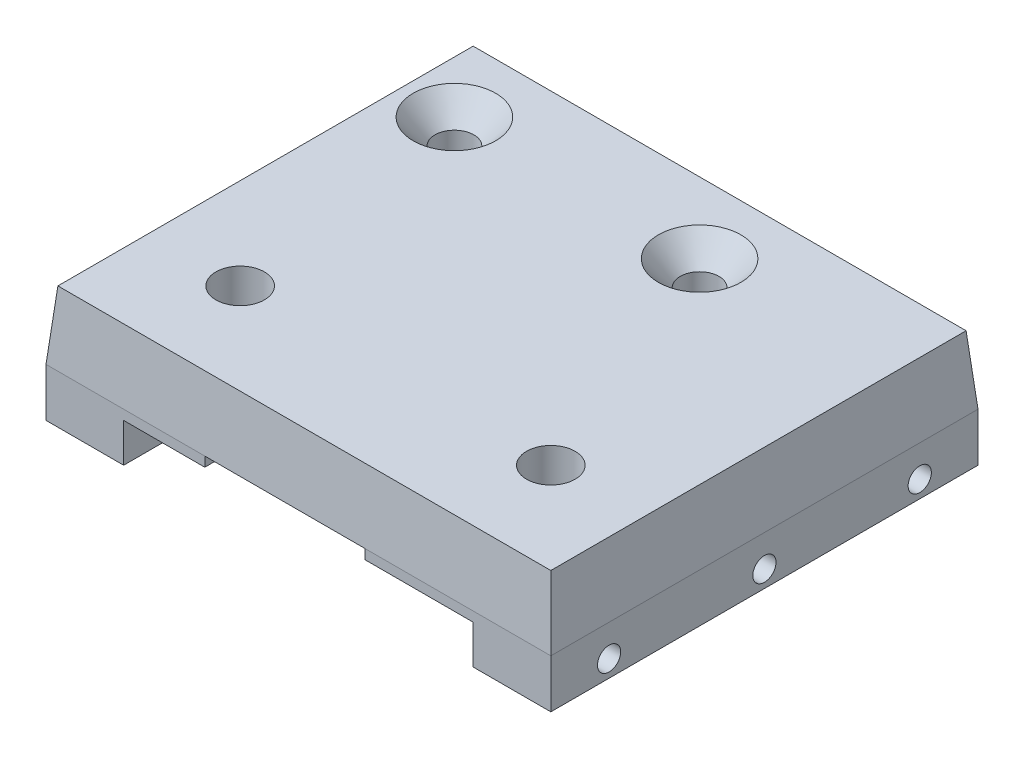
ISO-10303-21;
HEADER;
FILE_DESCRIPTION(('STEP AP214'),'2;1');
FILE_NAME('part.step','',(''),(''),'','','');
FILE_SCHEMA(('AUTOMOTIVE_DESIGN { 1 0 10303 214 1 1 1 1 }'));
ENDSEC;
DATA;
#1=APPLICATION_CONTEXT('core data for automotive mechanical design processes');
#2=APPLICATION_PROTOCOL_DEFINITION('international standard','automotive_design',2000,#1);
#3=PRODUCT_CONTEXT('',#1,'mechanical');
#4=PRODUCT('Part','Part','',(#3));
#5=PRODUCT_RELATED_PRODUCT_CATEGORY('part','',(#4));
#6=PRODUCT_DEFINITION_FORMATION('','',#4);
#7=PRODUCT_DEFINITION_CONTEXT('part definition',#1,'design');
#8=PRODUCT_DEFINITION('design','',#6,#7);
#9=PRODUCT_DEFINITION_SHAPE('','',#8);
#10=(LENGTH_UNIT() NAMED_UNIT(*) SI_UNIT(.MILLI.,.METRE.));
#11=(NAMED_UNIT(*) PLANE_ANGLE_UNIT() SI_UNIT($,.RADIAN.));
#12=(NAMED_UNIT(*) SI_UNIT($,.STERADIAN.) SOLID_ANGLE_UNIT());
#13=UNCERTAINTY_MEASURE_WITH_UNIT(LENGTH_MEASURE(1.E-05),#10,'distance_accuracy_value','');
#14=(GEOMETRIC_REPRESENTATION_CONTEXT(3) GLOBAL_UNCERTAINTY_ASSIGNED_CONTEXT((#13)) GLOBAL_UNIT_ASSIGNED_CONTEXT((#10,
#11,#12)) REPRESENTATION_CONTEXT('',''));
#15=CARTESIAN_POINT('',(0.,0.,0.));
#16=DIRECTION('',(0.,0.,1.));
#17=DIRECTION('',(1.,0.,0.));
#18=AXIS2_PLACEMENT_3D('',#15,#16,#17);
#19=CARTESIAN_POINT('',(0.,0.,0.));
#20=DIRECTION('',(0.,1.,0.));
#21=DIRECTION('',(0.,0.,1.));
#22=AXIS2_PLACEMENT_3D('',#19,#20,#21);
#23=PLANE('',#22);
#24=DIRECTION('',(0.,0.,-1.));
#25=VECTOR('',#24,1.);
#26=CARTESIAN_POINT('',(10.8908903883744,0.,34.925));
#27=LINE('',#26,#25);
#28=CARTESIAN_POINT('',(10.8908903883744,0.,34.925));
#29=VERTEX_POINT('',#28);
#30=CARTESIAN_POINT('',(10.8908903883744,0.,-34.925));
#31=VERTEX_POINT('',#30);
#32=EDGE_CURVE('E143',#29,#31,#27,.T.);
#33=ORIENTED_EDGE('',*,*,#32,.F.);
#34=DIRECTION('',(-1.,0.,0.));
#35=VECTOR('',#34,1.);
#36=CARTESIAN_POINT('',(0.,0.,34.925));
#37=LINE('',#36,#35);
#38=CARTESIAN_POINT('',(-15.3077386639732,0.,34.925));
#39=VERTEX_POINT('',#38);
#40=EDGE_CURVE('E99',#29,#39,#37,.T.);
#41=ORIENTED_EDGE('',*,*,#40,.T.);
#42=DIRECTION('',(0.,0.,1.));
#43=VECTOR('',#42,1.);
#44=CARTESIAN_POINT('',(-15.3077386639732,0.,34.925));
#45=LINE('',#44,#43);
#46=CARTESIAN_POINT('',(-15.3077386639732,0.,-34.925));
#47=VERTEX_POINT('',#46);
#48=EDGE_CURVE('E141',#47,#39,#45,.T.);
#49=ORIENTED_EDGE('',*,*,#48,.F.);
#50=DIRECTION('',(1.,0.,0.));
#51=VECTOR('',#50,1.);
#52=CARTESIAN_POINT('',(0.,0.,-34.925));
#53=LINE('',#52,#51);
#54=EDGE_CURVE('E123',#31,#47,#53,.F.);
#55=ORIENTED_EDGE('',*,*,#54,.F.);
#56=EDGE_LOOP('',(#33,#41,#49,#55));
#57=FACE_BOUND('',#56,.T.);
#58=ADVANCED_FACE('F38',(#57),#23,.F.);
#59=CARTESIAN_POINT('',(28.575,-7.9375,34.925));
#60=DIRECTION('',(1.,0.,0.));
#61=DIRECTION('',(0.,0.,-1.));
#62=AXIS2_PLACEMENT_3D('',#59,#60,#61);
#63=PLANE('',#62);
#64=CARTESIAN_POINT('',(28.575,-5.151627132439,25.4));
#65=DIRECTION('',(1.,0.,0.));
#66=DIRECTION('',(0.,0.,-1.));
#67=AXIS2_PLACEMENT_3D('',#64,#65,#66);
#68=CIRCLE('',#67,1.89864999999999);
#69=CARTESIAN_POINT('',(28.575,-5.151627132439,23.50135));
#70=VERTEX_POINT('',#69);
#71=EDGE_CURVE('E849',#70,#70,#68,.T.);
#72=ORIENTED_EDGE('',*,*,#71,.T.);
#73=EDGE_LOOP('',(#72));
#74=FACE_BOUND('',#73,.T.);
#75=CARTESIAN_POINT('',(28.575,-5.151627132439,-25.4));
#76=DIRECTION('',(1.,0.,0.));
#77=DIRECTION('',(0.,0.,-1.));
#78=AXIS2_PLACEMENT_3D('',#75,#76,#77);
#79=CIRCLE('',#78,1.89864999999999);
#80=CARTESIAN_POINT('',(28.575,-5.151627132439,-27.29865));
#81=VERTEX_POINT('',#80);
#82=EDGE_CURVE('E855',#81,#81,#79,.T.);
#83=ORIENTED_EDGE('',*,*,#82,.T.);
#84=EDGE_LOOP('',(#83));
#85=FACE_BOUND('',#84,.T.);
#86=CARTESIAN_POINT('',(28.575,-5.151627132439,0.));
#87=DIRECTION('',(1.,0.,0.));
#88=DIRECTION('',(0.,0.,-1.));
#89=AXIS2_PLACEMENT_3D('',#86,#87,#88);
#90=CIRCLE('',#89,1.89864999999999);
#91=CARTESIAN_POINT('',(28.575,-5.151627132439,-1.89865));
#92=VERTEX_POINT('',#91);
#93=EDGE_CURVE('E861',#92,#92,#90,.T.);
#94=ORIENTED_EDGE('',*,*,#93,.T.);
#95=EDGE_LOOP('',(#94));
#96=FACE_BOUND('',#95,.T.);
#97=DIRECTION('',(0.,0.,1.));
#98=VECTOR('',#97,1.);
#99=CARTESIAN_POINT('',(28.575,-1.5875,34.925));
#100=LINE('',#99,#98);
#101=CARTESIAN_POINT('',(28.575,-1.5875,-34.925));
#102=VERTEX_POINT('',#101);
#103=CARTESIAN_POINT('',(28.575,-1.5875,34.925));
#104=VERTEX_POINT('',#103);
#105=EDGE_CURVE('E864',#102,#104,#100,.T.);
#106=ORIENTED_EDGE('',*,*,#105,.F.);
#107=DIRECTION('',(0.,1.,0.));
#108=VECTOR('',#107,1.);
#109=CARTESIAN_POINT('',(28.575,-7.9375,-34.925));
#110=LINE('',#109,#108);
#111=CARTESIAN_POINT('',(28.575,-7.9375,-34.925));
#112=VERTEX_POINT('',#111);
#113=EDGE_CURVE('E193',#112,#102,#110,.T.);
#114=ORIENTED_EDGE('',*,*,#113,.F.);
#115=DIRECTION('',(0.,0.,-1.));
#116=VECTOR('',#115,1.);
#117=CARTESIAN_POINT('',(28.575,-7.9375,34.925));
#118=LINE('',#117,#116);
#119=CARTESIAN_POINT('',(28.575,-7.9375,34.925));
#120=VERTEX_POINT('',#119);
#121=EDGE_CURVE('E184',#120,#112,#118,.T.);
#122=ORIENTED_EDGE('',*,*,#121,.F.);
#123=DIRECTION('',(0.,1.,0.));
#124=VECTOR('',#123,1.);
#125=CARTESIAN_POINT('',(28.575,-7.9375,34.925));
#126=LINE('',#125,#124);
#127=EDGE_CURVE('E196',#120,#104,#126,.T.);
#128=ORIENTED_EDGE('',*,*,#127,.T.);
#129=EDGE_LOOP('',(#106,#114,#122,#128));
#130=FACE_BOUND('',#129,.T.);
#131=ADVANCED_FACE('F247',(#74,#85,#96,#130),#63,.F.);
#132=CARTESIAN_POINT('',(-41.275,0.,0.));
#133=DIRECTION('',(-0.996194698091746,0.0871557427476582,0.));
#134=DIRECTION('',(-0.0871557427476582,-0.996194698091746,0.));
#135=AXIS2_PLACEMENT_3D('',#132,#133,#134);
#136=PLANE('',#135);
#137=DIRECTION('',(0.,0.,-1.));
#138=VECTOR('',#137,1.);
#139=CARTESIAN_POINT('',(-41.275,0.,0.));
#140=LINE('',#139,#138);
#141=CARTESIAN_POINT('',(-41.275,0.,34.925));
#142=VERTEX_POINT('',#141);
#143=CARTESIAN_POINT('',(-41.275,0.,-34.925));
#144=VERTEX_POINT('',#143);
#145=EDGE_CURVE('E96',#142,#144,#140,.T.);
#146=ORIENTED_EDGE('',*,*,#145,.F.);
#147=DIRECTION('',(-0.0868265938642476,-0.992432509138967,0.0868265938642477));
#148=VECTOR('',#147,1.);
#149=CARTESIAN_POINT('',(-40.9638336607297,3.55664753271849,34.6138336607297));
#150=LINE('',#149,#148);
#151=CARTESIAN_POINT('',(-40.3027822265682,11.1125,33.9527822265682));
#152=VERTEX_POINT('',#151);
#153=EDGE_CURVE('E11',#152,#142,#150,.T.);
#154=ORIENTED_EDGE('',*,*,#153,.F.);
#155=DIRECTION('',(0.,0.,1.));
#156=VECTOR('',#155,1.);
#157=CARTESIAN_POINT('',(-40.3027822265682,11.1125,0.));
#158=LINE('',#157,#156);
#159=CARTESIAN_POINT('',(-40.3027822265682,11.1125,-33.9527822265682));
#160=VERTEX_POINT('',#159);
#161=EDGE_CURVE('E103',#160,#152,#158,.T.);
#162=ORIENTED_EDGE('',*,*,#161,.F.);
#163=DIRECTION('',(0.0868265938642476,0.992432509138967,0.0868265938642476));
#164=VECTOR('',#163,1.);
#165=CARTESIAN_POINT('',(-40.9638336607297,3.55664753271849,-34.6138336607297));
#166=LINE('',#165,#164);
#167=EDGE_CURVE('E86',#160,#144,#166,.F.);
#168=ORIENTED_EDGE('',*,*,#167,.T.);
#169=EDGE_LOOP('',(#146,#154,#162,#168));
#170=FACE_BOUND('',#169,.T.);
#171=ADVANCED_FACE('F251',(#170),#136,.T.);
#172=CARTESIAN_POINT('',(0.,0.,34.925));
#173=DIRECTION('',(0.,0.0871557427476582,0.996194698091746));
#174=DIRECTION('',(0.,-0.996194698091746,0.0871557427476582));
#175=AXIS2_PLACEMENT_3D('',#172,#173,#174);
#176=PLANE('',#175);
#177=CARTESIAN_POINT('',(41.275,0.,34.925));
#178=VERTEX_POINT('',#177);
#179=EDGE_CURVE('E124',#178,#29,#37,.T.);
#180=ORIENTED_EDGE('',*,*,#179,.F.);
#181=DIRECTION('',(-0.0868265938642476,0.992432509138967,-0.0868265938642476));
#182=VECTOR('',#181,1.);
#183=CARTESIAN_POINT('',(40.9638336607297,3.55664753271849,34.6138336607297));
#184=LINE('',#183,#182);
#185=CARTESIAN_POINT('',(40.3027822265682,11.1125,33.9527822265682));
#186=VERTEX_POINT('',#185);
#187=EDGE_CURVE('E48',#186,#178,#184,.F.);
#188=ORIENTED_EDGE('',*,*,#187,.F.);
#189=DIRECTION('',(1.,0.,0.));
#190=VECTOR('',#189,1.);
#191=CARTESIAN_POINT('',(0.,11.1125,33.9527822265682));
#192=LINE('',#191,#190);
#193=EDGE_CURVE('E94',#152,#186,#192,.T.);
#194=ORIENTED_EDGE('',*,*,#193,.F.);
#195=ORIENTED_EDGE('',*,*,#153,.T.);
#196=DIRECTION('',(-1.,0.,0.));
#197=VECTOR('',#196,1.);
#198=CARTESIAN_POINT('',(-41.275,0.,34.925));
#199=LINE('',#198,#197);
#200=EDGE_CURVE('E147',#39,#142,#199,.T.);
#201=ORIENTED_EDGE('',*,*,#200,.F.);
#202=ORIENTED_EDGE('',*,*,#40,.F.);
#203=EDGE_LOOP('',(#180,#188,#194,#195,#201,#202));
#204=FACE_BOUND('',#203,.T.);
#205=ADVANCED_FACE('F148',(#204),#176,.T.);
#206=CARTESIAN_POINT('',(41.275,0.,0.));
#207=DIRECTION('',(0.996194698091746,0.0871557427476582,0.));
#208=DIRECTION('',(-0.0871557427476582,0.996194698091746,0.));
#209=AXIS2_PLACEMENT_3D('',#206,#207,#208);
#210=PLANE('',#209);
#211=DIRECTION('',(0.,0.,1.));
#212=VECTOR('',#211,1.);
#213=CARTESIAN_POINT('',(41.275,0.,0.));
#214=LINE('',#213,#212);
#215=CARTESIAN_POINT('',(41.275,0.,-34.925));
#216=VERTEX_POINT('',#215);
#217=EDGE_CURVE('E83',#178,#216,#214,.F.);
#218=ORIENTED_EDGE('',*,*,#217,.T.);
#219=DIRECTION('',(0.0868265938642476,-0.992432509138967,-0.0868265938642477));
#220=VECTOR('',#219,1.);
#221=CARTESIAN_POINT('',(40.9638336607297,3.55664753271849,-34.6138336607297));
#222=LINE('',#221,#220);
#223=CARTESIAN_POINT('',(40.3027822265682,11.1125,-33.9527822265682));
#224=VERTEX_POINT('',#223);
#225=EDGE_CURVE('E79',#224,#216,#222,.T.);
#226=ORIENTED_EDGE('',*,*,#225,.F.);
#227=DIRECTION('',(0.,0.,1.));
#228=VECTOR('',#227,1.);
#229=CARTESIAN_POINT('',(40.3027822265682,11.1125,0.));
#230=LINE('',#229,#228);
#231=EDGE_CURVE('E42',#186,#224,#230,.F.);
#232=ORIENTED_EDGE('',*,*,#231,.F.);
#233=ORIENTED_EDGE('',*,*,#187,.T.);
#234=EDGE_LOOP('',(#218,#226,#232,#233));
#235=FACE_BOUND('',#234,.T.);
#236=ADVANCED_FACE('F40',(#235),#210,.T.);
#237=CARTESIAN_POINT('',(0.,0.,-34.925));
#238=DIRECTION('',(0.,0.0871557427476582,-0.996194698091746));
#239=DIRECTION('',(0.,0.996194698091746,0.0871557427476582));
#240=AXIS2_PLACEMENT_3D('',#237,#238,#239);
#241=PLANE('',#240);
#242=EDGE_CURVE('E119',#216,#31,#53,.F.);
#243=ORIENTED_EDGE('',*,*,#242,.T.);
#244=ORIENTED_EDGE('',*,*,#54,.T.);
#245=DIRECTION('',(1.,0.,0.));
#246=VECTOR('',#245,1.);
#247=CARTESIAN_POINT('',(-41.275,0.,-34.925));
#248=LINE('',#247,#246);
#249=EDGE_CURVE('E57',#144,#47,#248,.T.);
#250=ORIENTED_EDGE('',*,*,#249,.F.);
#251=ORIENTED_EDGE('',*,*,#167,.F.);
#252=DIRECTION('',(1.,0.,0.));
#253=VECTOR('',#252,1.);
#254=CARTESIAN_POINT('',(0.,11.1125,-33.9527822265682));
#255=LINE('',#254,#253);
#256=EDGE_CURVE('E92',#224,#160,#255,.F.);
#257=ORIENTED_EDGE('',*,*,#256,.F.);
#258=ORIENTED_EDGE('',*,*,#225,.T.);
#259=EDGE_LOOP('',(#243,#244,#250,#251,#257,#258));
#260=FACE_BOUND('',#259,.T.);
#261=ADVANCED_FACE('F95',(#260),#241,.T.);
#262=CARTESIAN_POINT('',(0.,11.1125,0.));
#263=DIRECTION('',(0.,-1.,0.));
#264=DIRECTION('',(0.,0.,-1.));
#265=AXIS2_PLACEMENT_3D('',#262,#263,#264);
#266=PLANE('',#265);
#267=CARTESIAN_POINT('',(-31.7953737035737,11.1125,-22.3788834050325));
#268=DIRECTION('',(0.,1.,0.));
#269=DIRECTION('',(0.,0.,1.));
#270=AXIS2_PLACEMENT_3D('',#267,#268,#269);
#271=CIRCLE('',#270,6.7437);
#272=CARTESIAN_POINT('',(-31.7953737035737,11.1125,-15.6351834050325));
#273=VERTEX_POINT('',#272);
#274=EDGE_CURVE('E828',#273,#273,#271,.T.);
#275=ORIENTED_EDGE('',*,*,#274,.F.);
#276=EDGE_LOOP('',(#275));
#277=FACE_BOUND('',#276,.T.);
#278=CARTESIAN_POINT('',(8.30040294266082,11.1125,-22.3788834050325));
#279=DIRECTION('',(0.,1.,0.));
#280=DIRECTION('',(0.,0.,1.));
#281=AXIS2_PLACEMENT_3D('',#278,#279,#280);
#282=CIRCLE('',#281,6.7437);
#283=CARTESIAN_POINT('',(8.30040294266082,11.1125,-15.6351834050325));
#284=VERTEX_POINT('',#283);
#285=EDGE_CURVE('E837',#284,#284,#282,.T.);
#286=ORIENTED_EDGE('',*,*,#285,.F.);
#287=EDGE_LOOP('',(#286));
#288=FACE_BOUND('',#287,.T.);
#289=CARTESIAN_POINT('',(-25.4,11.1125,19.05));
#290=DIRECTION('',(0.,1.,0.));
#291=DIRECTION('',(0.,0.,1.));
#292=AXIS2_PLACEMENT_3D('',#289,#290,#291);
#293=CIRCLE('',#292,3.96874999999999);
#294=CARTESIAN_POINT('',(-25.4,11.1125,23.01875));
#295=VERTEX_POINT('',#294);
#296=EDGE_CURVE('E223',#295,#295,#293,.T.);
#297=ORIENTED_EDGE('',*,*,#296,.F.);
#298=EDGE_LOOP('',(#297));
#299=FACE_BOUND('',#298,.T.);
#300=CARTESIAN_POINT('',(25.4,11.1125,19.05));
#301=DIRECTION('',(0.,1.,0.));
#302=DIRECTION('',(0.,0.,1.));
#303=AXIS2_PLACEMENT_3D('',#300,#301,#302);
#304=CIRCLE('',#303,3.96874999999999);
#305=CARTESIAN_POINT('',(25.4,11.1125,23.01875));
#306=VERTEX_POINT('',#305);
#307=EDGE_CURVE('E111',#306,#306,#304,.T.);
#308=ORIENTED_EDGE('',*,*,#307,.F.);
#309=EDGE_LOOP('',(#308));
#310=FACE_BOUND('',#309,.T.);
#311=ORIENTED_EDGE('',*,*,#161,.T.);
#312=ORIENTED_EDGE('',*,*,#193,.T.);
#313=ORIENTED_EDGE('',*,*,#231,.T.);
#314=ORIENTED_EDGE('',*,*,#256,.T.);
#315=EDGE_LOOP('',(#311,#312,#313,#314));
#316=FACE_BOUND('',#315,.T.);
#317=ADVANCED_FACE('F91',(#277,#288,#299,#310,#316),#266,.F.);
#318=CARTESIAN_POINT('',(25.4,1.5875,19.05));
#319=DIRECTION('',(0.,1.,0.));
#320=DIRECTION('',(0.,0.,1.));
#321=AXIS2_PLACEMENT_3D('',#318,#319,#320);
#322=CONICAL_SURFACE('',#321,3.96875,1.02974425867665);
#323=CARTESIAN_POINT('',(25.4,1.5875,19.05));
#324=DIRECTION('',(0.,1.,0.));
#325=DIRECTION('',(0.,0.,1.));
#326=AXIS2_PLACEMENT_3D('',#323,#324,#325);
#327=CIRCLE('',#326,3.96875);
#328=CARTESIAN_POINT('',(25.4,1.5875,23.01875));
#329=VERTEX_POINT('',#328);
#330=EDGE_CURVE('E106',#329,#329,#327,.T.);
#331=ORIENTED_EDGE('',*,*,#330,.T.);
#332=EDGE_LOOP('',(#331));
#333=FACE_BOUND('',#332,.T.);
#334=CARTESIAN_POINT('',(25.4,0.,19.05));
#335=DIRECTION('',(0.,1.,0.));
#336=DIRECTION('',(0.,0.,1.));
#337=AXIS2_PLACEMENT_3D('',#334,#335,#336);
#338=CIRCLE('',#337,1.32670632176855);
#339=CARTESIAN_POINT('',(25.4,0.,20.3767063217686));
#340=VERTEX_POINT('',#339);
#341=EDGE_CURVE('E104',#340,#340,#338,.T.);
#342=ORIENTED_EDGE('',*,*,#341,.F.);
#343=EDGE_LOOP('',(#342));
#344=FACE_BOUND('',#343,.T.);
#345=ADVANCED_FACE('F233',(#333,#344),#322,.F.);
#346=CARTESIAN_POINT('',(25.4,11.1125,19.05));
#347=DIRECTION('',(0.,1.,0.));
#348=DIRECTION('',(0.,0.,1.));
#349=AXIS2_PLACEMENT_3D('',#346,#347,#348);
#350=CYLINDRICAL_SURFACE('',#349,3.96874999999999);
#351=ORIENTED_EDGE('',*,*,#330,.F.);
#352=EDGE_LOOP('',(#351));
#353=FACE_BOUND('',#352,.T.);
#354=ORIENTED_EDGE('',*,*,#307,.T.);
#355=EDGE_LOOP('',(#354));
#356=FACE_BOUND('',#355,.T.);
#357=ADVANCED_FACE('F230',(#353,#356),#350,.F.);
#358=CARTESIAN_POINT('',(-25.4,1.5875,19.05));
#359=DIRECTION('',(0.,1.,0.));
#360=DIRECTION('',(0.,0.,1.));
#361=AXIS2_PLACEMENT_3D('',#358,#359,#360);
#362=CONICAL_SURFACE('',#361,3.96875,1.02974425867665);
#363=CARTESIAN_POINT('',(-25.4,1.5875,19.05));
#364=DIRECTION('',(0.,1.,0.));
#365=DIRECTION('',(0.,0.,1.));
#366=AXIS2_PLACEMENT_3D('',#363,#364,#365);
#367=CIRCLE('',#366,3.96875);
#368=CARTESIAN_POINT('',(-25.4,1.5875,23.01875));
#369=VERTEX_POINT('',#368);
#370=EDGE_CURVE('E118',#369,#369,#367,.T.);
#371=ORIENTED_EDGE('',*,*,#370,.T.);
#372=EDGE_LOOP('',(#371));
#373=FACE_BOUND('',#372,.T.);
#374=CARTESIAN_POINT('',(-25.4,0.,19.05));
#375=DIRECTION('',(0.,1.,0.));
#376=DIRECTION('',(0.,0.,1.));
#377=AXIS2_PLACEMENT_3D('',#374,#375,#376);
#378=CIRCLE('',#377,1.32670632176855);
#379=CARTESIAN_POINT('',(-25.4,0.,20.3767063217686));
#380=VERTEX_POINT('',#379);
#381=EDGE_CURVE('E115',#380,#380,#378,.T.);
#382=ORIENTED_EDGE('',*,*,#381,.F.);
#383=EDGE_LOOP('',(#382));
#384=FACE_BOUND('',#383,.T.);
#385=ADVANCED_FACE('F677',(#373,#384),#362,.F.);
#386=CARTESIAN_POINT('',(-25.4,11.1125,19.05));
#387=DIRECTION('',(0.,1.,0.));
#388=DIRECTION('',(0.,0.,1.));
#389=AXIS2_PLACEMENT_3D('',#386,#387,#388);
#390=CYLINDRICAL_SURFACE('',#389,3.96874999999999);
#391=ORIENTED_EDGE('',*,*,#370,.F.);
#392=EDGE_LOOP('',(#391));
#393=FACE_BOUND('',#392,.T.);
#394=ORIENTED_EDGE('',*,*,#296,.T.);
#395=EDGE_LOOP('',(#394));
#396=FACE_BOUND('',#395,.T.);
#397=ADVANCED_FACE('F664',(#393,#396),#390,.F.);
#398=CARTESIAN_POINT('',(-41.275,-7.9375,-34.925));
#399=DIRECTION('',(1.,0.,0.));
#400=DIRECTION('',(0.,0.,-1.));
#401=AXIS2_PLACEMENT_3D('',#398,#399,#400);
#402=PLANE('',#401);
#403=ORIENTED_EDGE('',*,*,#145,.T.);
#404=DIRECTION('',(0.,1.,0.));
#405=VECTOR('',#404,1.);
#406=CARTESIAN_POINT('',(-41.275,-7.9375,-34.925));
#407=LINE('',#406,#405);
#408=CARTESIAN_POINT('',(-41.275,-7.9375,-34.925));
#409=VERTEX_POINT('',#408);
#410=EDGE_CURVE('E220',#409,#144,#407,.T.);
#411=ORIENTED_EDGE('',*,*,#410,.F.);
#412=DIRECTION('',(0.,0.,-1.));
#413=VECTOR('',#412,1.);
#414=CARTESIAN_POINT('',(-41.275,-7.9375,-34.925));
#415=LINE('',#414,#413);
#416=CARTESIAN_POINT('',(-41.275,-7.9375,34.925));
#417=VERTEX_POINT('',#416);
#418=EDGE_CURVE('E154',#417,#409,#415,.T.);
#419=ORIENTED_EDGE('',*,*,#418,.F.);
#420=DIRECTION('',(0.,1.,0.));
#421=VECTOR('',#420,1.);
#422=CARTESIAN_POINT('',(-41.275,-7.9375,34.925));
#423=LINE('',#422,#421);
#424=EDGE_CURVE('E212',#417,#142,#423,.T.);
#425=ORIENTED_EDGE('',*,*,#424,.T.);
#426=EDGE_LOOP('',(#403,#411,#419,#425));
#427=FACE_BOUND('',#426,.T.);
#428=ADVANCED_FACE('F285',(#427),#402,.F.);
#429=CARTESIAN_POINT('',(-41.275,-7.9375,-34.925));
#430=DIRECTION('',(0.,0.,1.));
#431=DIRECTION('',(1.,0.,0.));
#432=AXIS2_PLACEMENT_3D('',#429,#430,#431);
#433=PLANE('',#432);
#434=ORIENTED_EDGE('',*,*,#249,.T.);
#435=DIRECTION('',(0.,1.,0.));
#436=VECTOR('',#435,1.);
#437=CARTESIAN_POINT('',(-15.3077386639732,-1.5875,-34.925));
#438=LINE('',#437,#436);
#439=CARTESIAN_POINT('',(-15.3077386639732,-1.5875,-34.925));
#440=VERTEX_POINT('',#439);
#441=EDGE_CURVE('E165',#440,#47,#438,.T.);
#442=ORIENTED_EDGE('',*,*,#441,.F.);
#443=DIRECTION('',(1.,0.,0.));
#444=VECTOR('',#443,1.);
#445=CARTESIAN_POINT('',(-28.575,-1.5875,-34.925));
#446=LINE('',#445,#444);
#447=CARTESIAN_POINT('',(-28.575,-1.5875,-34.925));
#448=VERTEX_POINT('',#447);
#449=EDGE_CURVE('E880',#448,#440,#446,.T.);
#450=ORIENTED_EDGE('',*,*,#449,.F.);
#451=DIRECTION('',(0.,1.,0.));
#452=VECTOR('',#451,1.);
#453=CARTESIAN_POINT('',(-28.575,-7.9375,-34.925));
#454=LINE('',#453,#452);
#455=CARTESIAN_POINT('',(-28.575,-7.9375,-34.925));
#456=VERTEX_POINT('',#455);
#457=EDGE_CURVE('E217',#456,#448,#454,.T.);
#458=ORIENTED_EDGE('',*,*,#457,.F.);
#459=DIRECTION('',(1.,0.,0.));
#460=VECTOR('',#459,1.);
#461=CARTESIAN_POINT('',(-41.275,-7.9375,-34.925));
#462=LINE('',#461,#460);
#463=EDGE_CURVE('E203',#409,#456,#462,.T.);
#464=ORIENTED_EDGE('',*,*,#463,.F.);
#465=ORIENTED_EDGE('',*,*,#410,.T.);
#466=EDGE_LOOP('',(#434,#442,#450,#458,#464,#465));
#467=FACE_BOUND('',#466,.T.);
#468=ADVANCED_FACE('F279',(#467),#433,.F.);
#469=CARTESIAN_POINT('',(-28.575,-7.9375,-34.925));
#470=DIRECTION('',(-1.,0.,0.));
#471=DIRECTION('',(0.,0.,1.));
#472=AXIS2_PLACEMENT_3D('',#469,#470,#471);
#473=PLANE('',#472);
#474=ORIENTED_EDGE('',*,*,#457,.T.);
#475=DIRECTION('',(0.,0.,-1.));
#476=VECTOR('',#475,1.);
#477=CARTESIAN_POINT('',(-28.575,-1.5875,34.925));
#478=LINE('',#477,#476);
#479=CARTESIAN_POINT('',(-28.575,-1.5875,34.925));
#480=VERTEX_POINT('',#479);
#481=EDGE_CURVE('E166',#480,#448,#478,.T.);
#482=ORIENTED_EDGE('',*,*,#481,.F.);
#483=DIRECTION('',(0.,1.,0.));
#484=VECTOR('',#483,1.);
#485=CARTESIAN_POINT('',(-28.575,-7.9375,34.925));
#486=LINE('',#485,#484);
#487=CARTESIAN_POINT('',(-28.575,-7.9375,34.925));
#488=VERTEX_POINT('',#487);
#489=EDGE_CURVE('E215',#488,#480,#486,.T.);
#490=ORIENTED_EDGE('',*,*,#489,.F.);
#491=DIRECTION('',(0.,0.,1.));
#492=VECTOR('',#491,1.);
#493=CARTESIAN_POINT('',(-28.575,-7.9375,-34.925));
#494=LINE('',#493,#492);
#495=EDGE_CURVE('E206',#456,#488,#494,.T.);
#496=ORIENTED_EDGE('',*,*,#495,.F.);
#497=EDGE_LOOP('',(#474,#482,#490,#496));
#498=FACE_BOUND('',#497,.T.);
#499=ADVANCED_FACE('F284',(#498),#473,.F.);
#500=CARTESIAN_POINT('',(-41.275,-7.9375,34.925));
#501=DIRECTION('',(0.,0.,-1.));
#502=DIRECTION('',(-1.,0.,0.));
#503=AXIS2_PLACEMENT_3D('',#500,#501,#502);
#504=PLANE('',#503);
#505=ORIENTED_EDGE('',*,*,#200,.T.);
#506=ORIENTED_EDGE('',*,*,#424,.F.);
#507=DIRECTION('',(-1.,0.,0.));
#508=VECTOR('',#507,1.);
#509=CARTESIAN_POINT('',(-41.275,-7.9375,34.925));
#510=LINE('',#509,#508);
#511=EDGE_CURVE('E209',#488,#417,#510,.T.);
#512=ORIENTED_EDGE('',*,*,#511,.F.);
#513=ORIENTED_EDGE('',*,*,#489,.T.);
#514=DIRECTION('',(-1.,0.,0.));
#515=VECTOR('',#514,1.);
#516=CARTESIAN_POINT('',(-28.575,-1.5875,34.925));
#517=LINE('',#516,#515);
#518=CARTESIAN_POINT('',(-15.3077386639732,-1.5875,34.925));
#519=VERTEX_POINT('',#518);
#520=EDGE_CURVE('E172',#519,#480,#517,.T.);
#521=ORIENTED_EDGE('',*,*,#520,.F.);
#522=DIRECTION('',(0.,1.,0.));
#523=VECTOR('',#522,1.);
#524=CARTESIAN_POINT('',(-15.3077386639732,-1.5875,34.925));
#525=LINE('',#524,#523);
#526=EDGE_CURVE('E162',#519,#39,#525,.T.);
#527=ORIENTED_EDGE('',*,*,#526,.T.);
#528=EDGE_LOOP('',(#505,#506,#512,#513,#521,#527));
#529=FACE_BOUND('',#528,.T.);
#530=ADVANCED_FACE('F169',(#529),#504,.F.);
#531=CARTESIAN_POINT('',(0.,-7.9375,0.));
#532=DIRECTION('',(0.,1.,0.));
#533=DIRECTION('',(0.,0.,1.));
#534=AXIS2_PLACEMENT_3D('',#531,#532,#533);
#535=PLANE('',#534);
#536=CARTESIAN_POINT('',(-33.3375000000001,-7.9375,15.875));
#537=DIRECTION('',(0.,-1.,0.));
#538=DIRECTION('',(0.,0.,-1.));
#539=AXIS2_PLACEMENT_3D('',#536,#537,#538);
#540=CIRCLE('',#539,2.5527);
#541=CARTESIAN_POINT('',(-33.3375000000001,-7.9375,13.3223));
#542=VERTEX_POINT('',#541);
#543=EDGE_CURVE('E806',#542,#542,#540,.T.);
#544=ORIENTED_EDGE('',*,*,#543,.F.);
#545=EDGE_LOOP('',(#544));
#546=FACE_BOUND('',#545,.T.);
#547=CARTESIAN_POINT('',(-33.3375000000001,-7.9375,-15.875));
#548=DIRECTION('',(0.,-1.,0.));
#549=DIRECTION('',(0.,0.,-1.));
#550=AXIS2_PLACEMENT_3D('',#547,#548,#549);
#551=CIRCLE('',#550,2.5527);
#552=CARTESIAN_POINT('',(-33.3375000000001,-7.9375,-18.4277));
#553=VERTEX_POINT('',#552);
#554=EDGE_CURVE('E805',#553,#553,#551,.T.);
#555=ORIENTED_EDGE('',*,*,#554,.F.);
#556=EDGE_LOOP('',(#555));
#557=FACE_BOUND('',#556,.T.);
#558=ORIENTED_EDGE('',*,*,#418,.T.);
#559=ORIENTED_EDGE('',*,*,#463,.T.);
#560=ORIENTED_EDGE('',*,*,#495,.T.);
#561=ORIENTED_EDGE('',*,*,#511,.T.);
#562=EDGE_LOOP('',(#558,#559,#560,#561));
#563=FACE_BOUND('',#562,.T.);
#564=ADVANCED_FACE('F308',(#546,#557,#563),#535,.F.);
#565=CARTESIAN_POINT('',(41.275,-7.9375,34.925));
#566=DIRECTION('',(-1.,0.,0.));
#567=DIRECTION('',(0.,0.,1.));
#568=AXIS2_PLACEMENT_3D('',#565,#566,#567);
#569=PLANE('',#568);
#570=CARTESIAN_POINT('',(41.275,-5.151627132439,25.4));
#571=DIRECTION('',(1.,0.,0.));
#572=DIRECTION('',(0.,0.,-1.));
#573=AXIS2_PLACEMENT_3D('',#570,#571,#572);
#574=CIRCLE('',#573,1.89864999999999);
#575=CARTESIAN_POINT('',(41.275,-5.151627132439,23.50135));
#576=VERTEX_POINT('',#575);
#577=EDGE_CURVE('E846',#576,#576,#574,.T.);
#578=ORIENTED_EDGE('',*,*,#577,.F.);
#579=EDGE_LOOP('',(#578));
#580=FACE_BOUND('',#579,.T.);
#581=CARTESIAN_POINT('',(41.275,-5.151627132439,-25.4));
#582=DIRECTION('',(1.,0.,0.));
#583=DIRECTION('',(0.,0.,-1.));
#584=AXIS2_PLACEMENT_3D('',#581,#582,#583);
#585=CIRCLE('',#584,1.89864999999999);
#586=CARTESIAN_POINT('',(41.275,-5.151627132439,-27.29865));
#587=VERTEX_POINT('',#586);
#588=EDGE_CURVE('E852',#587,#587,#585,.T.);
#589=ORIENTED_EDGE('',*,*,#588,.F.);
#590=EDGE_LOOP('',(#589));
#591=FACE_BOUND('',#590,.T.);
#592=CARTESIAN_POINT('',(41.275,-5.151627132439,0.));
#593=DIRECTION('',(1.,0.,0.));
#594=DIRECTION('',(0.,0.,-1.));
#595=AXIS2_PLACEMENT_3D('',#592,#593,#594);
#596=CIRCLE('',#595,1.89864999999999);
#597=CARTESIAN_POINT('',(41.275,-5.151627132439,-1.89864999999999));
#598=VERTEX_POINT('',#597);
#599=EDGE_CURVE('E858',#598,#598,#596,.T.);
#600=ORIENTED_EDGE('',*,*,#599,.F.);
#601=EDGE_LOOP('',(#600));
#602=FACE_BOUND('',#601,.T.);
#603=ORIENTED_EDGE('',*,*,#217,.F.);
#604=DIRECTION('',(0.,1.,0.));
#605=VECTOR('',#604,1.);
#606=CARTESIAN_POINT('',(41.275,-7.9375,34.925));
#607=LINE('',#606,#605);
#608=CARTESIAN_POINT('',(41.275,-7.9375,34.925));
#609=VERTEX_POINT('',#608);
#610=EDGE_CURVE('E199',#609,#178,#607,.T.);
#611=ORIENTED_EDGE('',*,*,#610,.F.);
#612=DIRECTION('',(0.,0.,1.));
#613=VECTOR('',#612,1.);
#614=CARTESIAN_POINT('',(41.275,-7.9375,34.925));
#615=LINE('',#614,#613);
#616=CARTESIAN_POINT('',(41.275,-7.9375,-34.925));
#617=VERTEX_POINT('',#616);
#618=EDGE_CURVE('E174',#617,#609,#615,.T.);
#619=ORIENTED_EDGE('',*,*,#618,.F.);
#620=DIRECTION('',(0.,1.,0.));
#621=VECTOR('',#620,1.);
#622=CARTESIAN_POINT('',(41.275,-7.9375,-34.925));
#623=LINE('',#622,#621);
#624=EDGE_CURVE('E190',#617,#216,#623,.T.);
#625=ORIENTED_EDGE('',*,*,#624,.T.);
#626=EDGE_LOOP('',(#603,#611,#619,#625));
#627=FACE_BOUND('',#626,.T.);
#628=ADVANCED_FACE('F320',(#580,#591,#602,#627),#569,.F.);
#629=CARTESIAN_POINT('',(41.275,-7.9375,34.925));
#630=DIRECTION('',(0.,0.,-1.));
#631=DIRECTION('',(-1.,0.,0.));
#632=AXIS2_PLACEMENT_3D('',#629,#630,#631);
#633=PLANE('',#632);
#634=ORIENTED_EDGE('',*,*,#179,.T.);
#635=DIRECTION('',(0.,1.,0.));
#636=VECTOR('',#635,1.);
#637=CARTESIAN_POINT('',(10.8908903883744,-1.5875,34.925));
#638=LINE('',#637,#636);
#639=CARTESIAN_POINT('',(10.8908903883744,-1.5875,34.925));
#640=VERTEX_POINT('',#639);
#641=EDGE_CURVE('E167',#640,#29,#638,.T.);
#642=ORIENTED_EDGE('',*,*,#641,.F.);
#643=DIRECTION('',(-1.,0.,0.));
#644=VECTOR('',#643,1.);
#645=CARTESIAN_POINT('',(28.575,-1.5875,34.925));
#646=LINE('',#645,#644);
#647=EDGE_CURVE('E867',#104,#640,#646,.T.);
#648=ORIENTED_EDGE('',*,*,#647,.F.);
#649=ORIENTED_EDGE('',*,*,#127,.F.);
#650=DIRECTION('',(-1.,0.,0.));
#651=VECTOR('',#650,1.);
#652=CARTESIAN_POINT('',(41.275,-7.9375,34.925));
#653=LINE('',#652,#651);
#654=EDGE_CURVE('E181',#609,#120,#653,.T.);
#655=ORIENTED_EDGE('',*,*,#654,.F.);
#656=ORIENTED_EDGE('',*,*,#610,.T.);
#657=EDGE_LOOP('',(#634,#642,#648,#649,#655,#656));
#658=FACE_BOUND('',#657,.T.);
#659=ADVANCED_FACE('F315',(#658),#633,.F.);
#660=CARTESIAN_POINT('',(41.275,-7.9375,-34.925));
#661=DIRECTION('',(0.,0.,1.));
#662=DIRECTION('',(1.,0.,0.));
#663=AXIS2_PLACEMENT_3D('',#660,#661,#662);
#664=PLANE('',#663);
#665=ORIENTED_EDGE('',*,*,#242,.F.);
#666=ORIENTED_EDGE('',*,*,#624,.F.);
#667=DIRECTION('',(1.,0.,0.));
#668=VECTOR('',#667,1.);
#669=CARTESIAN_POINT('',(41.275,-7.9375,-34.925));
#670=LINE('',#669,#668);
#671=EDGE_CURVE('E187',#112,#617,#670,.T.);
#672=ORIENTED_EDGE('',*,*,#671,.F.);
#673=ORIENTED_EDGE('',*,*,#113,.T.);
#674=DIRECTION('',(1.,0.,0.));
#675=VECTOR('',#674,1.);
#676=CARTESIAN_POINT('',(28.575,-1.5875,-34.925));
#677=LINE('',#676,#675);
#678=CARTESIAN_POINT('',(10.8908903883744,-1.5875,-34.925));
#679=VERTEX_POINT('',#678);
#680=EDGE_CURVE('E871',#679,#102,#677,.T.);
#681=ORIENTED_EDGE('',*,*,#680,.F.);
#682=DIRECTION('',(0.,1.,0.));
#683=VECTOR('',#682,1.);
#684=CARTESIAN_POINT('',(10.8908903883744,-1.5875,-34.925));
#685=LINE('',#684,#683);
#686=EDGE_CURVE('E873',#679,#31,#685,.T.);
#687=ORIENTED_EDGE('',*,*,#686,.T.);
#688=EDGE_LOOP('',(#665,#666,#672,#673,#681,#687));
#689=FACE_BOUND('',#688,.T.);
#690=ADVANCED_FACE('F319',(#689),#664,.F.);
#691=CARTESIAN_POINT('',(0.,-7.9375,0.));
#692=DIRECTION('',(0.,1.,0.));
#693=DIRECTION('',(0.,0.,1.));
#694=AXIS2_PLACEMENT_3D('',#691,#692,#693);
#695=PLANE('',#694);
#696=CARTESIAN_POINT('',(33.3375,-7.9375,-15.875));
#697=DIRECTION('',(0.,-1.,0.));
#698=DIRECTION('',(0.,0.,-1.));
#699=AXIS2_PLACEMENT_3D('',#696,#697,#698);
#700=CIRCLE('',#699,2.5527);
#701=CARTESIAN_POINT('',(33.3375,-7.9375,-18.4277));
#702=VERTEX_POINT('',#701);
#703=EDGE_CURVE('E816',#702,#702,#700,.T.);
#704=ORIENTED_EDGE('',*,*,#703,.F.);
#705=EDGE_LOOP('',(#704));
#706=FACE_BOUND('',#705,.T.);
#707=CARTESIAN_POINT('',(33.3375,-7.9375,15.875));
#708=DIRECTION('',(0.,-1.,0.));
#709=DIRECTION('',(0.,0.,-1.));
#710=AXIS2_PLACEMENT_3D('',#707,#708,#709);
#711=CIRCLE('',#710,2.5527);
#712=CARTESIAN_POINT('',(33.3375,-7.9375,13.3223));
#713=VERTEX_POINT('',#712);
#714=EDGE_CURVE('E822',#713,#713,#711,.T.);
#715=ORIENTED_EDGE('',*,*,#714,.F.);
#716=EDGE_LOOP('',(#715));
#717=FACE_BOUND('',#716,.T.);
#718=ORIENTED_EDGE('',*,*,#618,.T.);
#719=ORIENTED_EDGE('',*,*,#654,.T.);
#720=ORIENTED_EDGE('',*,*,#121,.T.);
#721=ORIENTED_EDGE('',*,*,#671,.T.);
#722=EDGE_LOOP('',(#718,#719,#720,#721));
#723=FACE_BOUND('',#722,.T.);
#724=ADVANCED_FACE('F331',(#706,#717,#723),#695,.F.);
#725=CARTESIAN_POINT('',(0.,-1.5875,0.));
#726=DIRECTION('',(0.,-1.,0.));
#727=DIRECTION('',(0.,0.,-1.));
#728=AXIS2_PLACEMENT_3D('',#725,#726,#727);
#729=PLANE('',#728);
#730=ORIENTED_EDGE('',*,*,#481,.T.);
#731=ORIENTED_EDGE('',*,*,#449,.T.);
#732=DIRECTION('',(0.,0.,1.));
#733=VECTOR('',#732,1.);
#734=CARTESIAN_POINT('',(-15.3077386639732,-1.5875,34.925));
#735=LINE('',#734,#733);
#736=EDGE_CURVE('E176',#440,#519,#735,.T.);
#737=ORIENTED_EDGE('',*,*,#736,.T.);
#738=ORIENTED_EDGE('',*,*,#520,.T.);
#739=EDGE_LOOP('',(#730,#731,#737,#738));
#740=FACE_BOUND('',#739,.T.);
#741=ADVANCED_FACE('F340',(#740),#729,.T.);
#742=CARTESIAN_POINT('',(-15.3077386639732,-1.5875,34.925));
#743=DIRECTION('',(-1.,0.,0.));
#744=DIRECTION('',(0.,0.,1.));
#745=AXIS2_PLACEMENT_3D('',#742,#743,#744);
#746=PLANE('',#745);
#747=ORIENTED_EDGE('',*,*,#48,.T.);
#748=ORIENTED_EDGE('',*,*,#526,.F.);
#749=ORIENTED_EDGE('',*,*,#736,.F.);
#750=ORIENTED_EDGE('',*,*,#441,.T.);
#751=EDGE_LOOP('',(#747,#748,#749,#750));
#752=FACE_BOUND('',#751,.T.);
#753=ADVANCED_FACE('F159',(#752),#746,.F.);
#754=CARTESIAN_POINT('',(0.,0.,0.));
#755=DIRECTION('',(0.,-1.,0.));
#756=DIRECTION('',(0.,0.,-1.));
#757=AXIS2_PLACEMENT_3D('',#754,#755,#756);
#758=PLANE('',#757);
#759=ORIENTED_EDGE('',*,*,#381,.T.);
#760=EDGE_LOOP('',(#759));
#761=FACE_BOUND('',#760,.T.);
#762=ADVANCED_FACE('F353',(#761),#758,.F.);
#763=CARTESIAN_POINT('',(0.,-1.5875,0.));
#764=DIRECTION('',(0.,1.,0.));
#765=DIRECTION('',(0.,0.,1.));
#766=AXIS2_PLACEMENT_3D('',#763,#764,#765);
#767=PLANE('',#766);
#768=ORIENTED_EDGE('',*,*,#105,.T.);
#769=ORIENTED_EDGE('',*,*,#647,.T.);
#770=DIRECTION('',(0.,0.,-1.));
#771=VECTOR('',#770,1.);
#772=CARTESIAN_POINT('',(10.8908903883744,-1.5875,34.925));
#773=LINE('',#772,#771);
#774=EDGE_CURVE('E869',#640,#679,#773,.T.);
#775=ORIENTED_EDGE('',*,*,#774,.T.);
#776=ORIENTED_EDGE('',*,*,#680,.T.);
#777=EDGE_LOOP('',(#768,#769,#775,#776));
#778=FACE_BOUND('',#777,.T.);
#779=ADVANCED_FACE('F362',(#778),#767,.F.);
#780=CARTESIAN_POINT('',(10.8908903883744,-1.5875,34.925));
#781=DIRECTION('',(1.,0.,0.));
#782=DIRECTION('',(0.,0.,-1.));
#783=AXIS2_PLACEMENT_3D('',#780,#781,#782);
#784=PLANE('',#783);
#785=ORIENTED_EDGE('',*,*,#32,.T.);
#786=ORIENTED_EDGE('',*,*,#686,.F.);
#787=ORIENTED_EDGE('',*,*,#774,.F.);
#788=ORIENTED_EDGE('',*,*,#641,.T.);
#789=EDGE_LOOP('',(#785,#786,#787,#788));
#790=FACE_BOUND('',#789,.T.);
#791=ADVANCED_FACE('F372',(#790),#784,.F.);
#792=CARTESIAN_POINT('',(0.,0.,0.));
#793=DIRECTION('',(0.,1.,0.));
#794=DIRECTION('',(0.,0.,1.));
#795=AXIS2_PLACEMENT_3D('',#792,#793,#794);
#796=PLANE('',#795);
#797=ORIENTED_EDGE('',*,*,#341,.T.);
#798=EDGE_LOOP('',(#797));
#799=FACE_BOUND('',#798,.T.);
#800=ADVANCED_FACE('F382',(#799),#796,.T.);
#801=CARTESIAN_POINT('',(41.275,-5.151627132439,0.));
#802=DIRECTION('',(1.,0.,0.));
#803=DIRECTION('',(0.,0.,-1.));
#804=AXIS2_PLACEMENT_3D('',#801,#802,#803);
#805=CYLINDRICAL_SURFACE('',#804,1.89864999999999);
#806=ORIENTED_EDGE('',*,*,#93,.F.);
#807=EDGE_LOOP('',(#806));
#808=FACE_BOUND('',#807,.T.);
#809=ORIENTED_EDGE('',*,*,#599,.T.);
#810=EDGE_LOOP('',(#809));
#811=FACE_BOUND('',#810,.T.);
#812=ADVANCED_FACE('F392',(#808,#811),#805,.F.);
#813=CARTESIAN_POINT('',(41.275,-5.151627132439,-25.4));
#814=DIRECTION('',(1.,0.,0.));
#815=DIRECTION('',(0.,0.,-1.));
#816=AXIS2_PLACEMENT_3D('',#813,#814,#815);
#817=CYLINDRICAL_SURFACE('',#816,1.89864999999999);
#818=ORIENTED_EDGE('',*,*,#82,.F.);
#819=EDGE_LOOP('',(#818));
#820=FACE_BOUND('',#819,.T.);
#821=ORIENTED_EDGE('',*,*,#588,.T.);
#822=EDGE_LOOP('',(#821));
#823=FACE_BOUND('',#822,.T.);
#824=ADVANCED_FACE('F422',(#820,#823),#817,.F.);
#825=CARTESIAN_POINT('',(41.275,-5.151627132439,25.4));
#826=DIRECTION('',(1.,0.,0.));
#827=DIRECTION('',(0.,0.,-1.));
#828=AXIS2_PLACEMENT_3D('',#825,#826,#827);
#829=CYLINDRICAL_SURFACE('',#828,1.89864999999999);
#830=ORIENTED_EDGE('',*,*,#71,.F.);
#831=EDGE_LOOP('',(#830));
#832=FACE_BOUND('',#831,.T.);
#833=ORIENTED_EDGE('',*,*,#577,.T.);
#834=EDGE_LOOP('',(#833));
#835=FACE_BOUND('',#834,.T.);
#836=ADVANCED_FACE('F434',(#832,#835),#829,.F.);
#837=CARTESIAN_POINT('',(8.30040294266082,2.22250000000001,-22.3788834050325));
#838=DIRECTION('',(0.,1.,0.));
#839=DIRECTION('',(0.,0.,1.));
#840=AXIS2_PLACEMENT_3D('',#837,#838,#839);
#841=CONICAL_SURFACE('',#840,3.17499999999999,1.02974425867665);
#842=CARTESIAN_POINT('',(8.30040294266082,0.31476753458751,-22.3788834050325));
#843=VERTEX_POINT('',#842);
#844=VERTEX_LOOP('',#843);
#845=FACE_BOUND('',#844,.T.);
#846=CARTESIAN_POINT('',(8.30040294266082,2.22250000000001,-22.3788834050325));
#847=DIRECTION('',(0.,1.,0.));
#848=DIRECTION('',(0.,0.,1.));
#849=AXIS2_PLACEMENT_3D('',#846,#847,#848);
#850=CIRCLE('',#849,3.17499999999999);
#851=CARTESIAN_POINT('',(8.30040294266082,2.22250000000001,-19.2038834050325));
#852=VERTEX_POINT('',#851);
#853=EDGE_CURVE('E843',#852,#852,#850,.T.);
#854=ORIENTED_EDGE('',*,*,#853,.T.);
#855=EDGE_LOOP('',(#854));
#856=FACE_BOUND('',#855,.T.);
#857=ADVANCED_FACE('F445',(#845,#856),#841,.F.);
#858=CARTESIAN_POINT('',(8.30040294266082,11.1125,-22.3788834050325));
#859=DIRECTION('',(0.,1.,0.));
#860=DIRECTION('',(0.,0.,1.));
#861=AXIS2_PLACEMENT_3D('',#858,#859,#860);
#862=CYLINDRICAL_SURFACE('',#861,3.17499999999999);
#863=ORIENTED_EDGE('',*,*,#853,.F.);
#864=EDGE_LOOP('',(#863));
#865=FACE_BOUND('',#864,.T.);
#866=CARTESIAN_POINT('',(8.30040294266082,7.00718026515038,-22.3788834050325));
#867=DIRECTION('',(0.,1.,0.));
#868=DIRECTION('',(0.,0.,1.));
#869=AXIS2_PLACEMENT_3D('',#866,#867,#868);
#870=CIRCLE('',#869,3.175);
#871=CARTESIAN_POINT('',(8.30040294266082,7.00718026515038,-19.2038834050325));
#872=VERTEX_POINT('',#871);
#873=EDGE_CURVE('E840',#872,#872,#870,.T.);
#874=ORIENTED_EDGE('',*,*,#873,.T.);
#875=EDGE_LOOP('',(#874));
#876=FACE_BOUND('',#875,.T.);
#877=ADVANCED_FACE('F462',(#865,#876),#862,.F.);
#878=CARTESIAN_POINT('',(8.30040294266082,11.1125,-22.3788834050325));
#879=DIRECTION('',(0.,1.,0.));
#880=DIRECTION('',(0.,0.,1.));
#881=AXIS2_PLACEMENT_3D('',#878,#879,#880);
#882=CONICAL_SURFACE('',#881,6.7437,0.715584993317675);
#883=ORIENTED_EDGE('',*,*,#873,.F.);
#884=EDGE_LOOP('',(#883));
#885=FACE_BOUND('',#884,.T.);
#886=ORIENTED_EDGE('',*,*,#285,.T.);
#887=EDGE_LOOP('',(#886));
#888=FACE_BOUND('',#887,.T.);
#889=ADVANCED_FACE('F472',(#885,#888),#882,.F.);
#890=CARTESIAN_POINT('',(-31.7953737035737,2.22250000000001,-22.3788834050325));
#891=DIRECTION('',(0.,1.,0.));
#892=DIRECTION('',(0.,0.,1.));
#893=AXIS2_PLACEMENT_3D('',#890,#891,#892);
#894=CONICAL_SURFACE('',#893,3.17499999999999,1.02974425867665);
#895=CARTESIAN_POINT('',(-31.7953737035737,0.31476753458751,-22.3788834050325));
#896=VERTEX_POINT('',#895);
#897=VERTEX_LOOP('',#896);
#898=FACE_BOUND('',#897,.T.);
#899=CARTESIAN_POINT('',(-31.7953737035737,2.22250000000001,-22.3788834050325));
#900=DIRECTION('',(0.,1.,0.));
#901=DIRECTION('',(0.,0.,1.));
#902=AXIS2_PLACEMENT_3D('',#899,#900,#901);
#903=CIRCLE('',#902,3.17499999999999);
#904=CARTESIAN_POINT('',(-31.7953737035737,2.22250000000001,-19.2038834050325));
#905=VERTEX_POINT('',#904);
#906=EDGE_CURVE('E834',#905,#905,#903,.T.);
#907=ORIENTED_EDGE('',*,*,#906,.T.);
#908=EDGE_LOOP('',(#907));
#909=FACE_BOUND('',#908,.T.);
#910=ADVANCED_FACE('F482',(#898,#909),#894,.F.);
#911=CARTESIAN_POINT('',(-31.7953737035737,11.1125,-22.3788834050325));
#912=DIRECTION('',(0.,1.,0.));
#913=DIRECTION('',(0.,0.,1.));
#914=AXIS2_PLACEMENT_3D('',#911,#912,#913);
#915=CYLINDRICAL_SURFACE('',#914,3.17499999999999);
#916=ORIENTED_EDGE('',*,*,#906,.F.);
#917=EDGE_LOOP('',(#916));
#918=FACE_BOUND('',#917,.T.);
#919=CARTESIAN_POINT('',(-31.7953737035737,7.00718026515038,-22.3788834050325));
#920=DIRECTION('',(0.,1.,0.));
#921=DIRECTION('',(0.,0.,1.));
#922=AXIS2_PLACEMENT_3D('',#919,#920,#921);
#923=CIRCLE('',#922,3.175);
#924=CARTESIAN_POINT('',(-31.7953737035737,7.00718026515038,-19.2038834050325));
#925=VERTEX_POINT('',#924);
#926=EDGE_CURVE('E831',#925,#925,#923,.T.);
#927=ORIENTED_EDGE('',*,*,#926,.T.);
#928=EDGE_LOOP('',(#927));
#929=FACE_BOUND('',#928,.T.);
#930=ADVANCED_FACE('F492',(#918,#929),#915,.F.);
#931=CARTESIAN_POINT('',(-31.7953737035737,11.1125,-22.3788834050325));
#932=DIRECTION('',(0.,1.,0.));
#933=DIRECTION('',(0.,0.,1.));
#934=AXIS2_PLACEMENT_3D('',#931,#932,#933);
#935=CONICAL_SURFACE('',#934,6.7437,0.715584993317675);
#936=ORIENTED_EDGE('',*,*,#926,.F.);
#937=EDGE_LOOP('',(#936));
#938=FACE_BOUND('',#937,.T.);
#939=ORIENTED_EDGE('',*,*,#274,.T.);
#940=EDGE_LOOP('',(#939));
#941=FACE_BOUND('',#940,.T.);
#942=ADVANCED_FACE('F502',(#938,#941),#935,.F.);
#943=CARTESIAN_POINT('',(33.3375,3.4925,15.875));
#944=DIRECTION('',(0.,-1.,0.));
#945=DIRECTION('',(0.,0.,-1.));
#946=AXIS2_PLACEMENT_3D('',#943,#944,#945);
#947=CONICAL_SURFACE('',#946,2.5527,1.02974425867665);
#948=CARTESIAN_POINT('',(33.3375,5.02631690219165,15.875));
#949=VERTEX_POINT('',#948);
#950=VERTEX_LOOP('',#949);
#951=FACE_BOUND('',#950,.T.);
#952=CARTESIAN_POINT('',(33.3375,3.4925,15.875));
#953=DIRECTION('',(0.,-1.,0.));
#954=DIRECTION('',(0.,0.,-1.));
#955=AXIS2_PLACEMENT_3D('',#952,#953,#954);
#956=CIRCLE('',#955,2.5527);
#957=CARTESIAN_POINT('',(33.3375,3.4925,13.3223));
#958=VERTEX_POINT('',#957);
#959=EDGE_CURVE('E825',#958,#958,#956,.T.);
#960=ORIENTED_EDGE('',*,*,#959,.T.);
#961=EDGE_LOOP('',(#960));
#962=FACE_BOUND('',#961,.T.);
#963=ADVANCED_FACE('F512',(#951,#962),#947,.F.);
#964=CARTESIAN_POINT('',(33.3375,-7.9375,15.875));
#965=DIRECTION('',(0.,-1.,0.));
#966=DIRECTION('',(0.,0.,-1.));
#967=AXIS2_PLACEMENT_3D('',#964,#965,#966);
#968=CYLINDRICAL_SURFACE('',#967,2.5527);
#969=ORIENTED_EDGE('',*,*,#959,.F.);
#970=EDGE_LOOP('',(#969));
#971=FACE_BOUND('',#970,.T.);
#972=ORIENTED_EDGE('',*,*,#714,.T.);
#973=EDGE_LOOP('',(#972));
#974=FACE_BOUND('',#973,.T.);
#975=ADVANCED_FACE('F535',(#971,#974),#968,.F.);
#976=CARTESIAN_POINT('',(33.3375,3.4925,-15.875));
#977=DIRECTION('',(0.,-1.,0.));
#978=DIRECTION('',(0.,0.,-1.));
#979=AXIS2_PLACEMENT_3D('',#976,#977,#978);
#980=CONICAL_SURFACE('',#979,2.5527,1.02974425867665);
#981=CARTESIAN_POINT('',(33.3375,5.02631690219165,-15.875));
#982=VERTEX_POINT('',#981);
#983=VERTEX_LOOP('',#982);
#984=FACE_BOUND('',#983,.T.);
#985=CARTESIAN_POINT('',(33.3375,3.4925,-15.875));
#986=DIRECTION('',(0.,-1.,0.));
#987=DIRECTION('',(0.,0.,-1.));
#988=AXIS2_PLACEMENT_3D('',#985,#986,#987);
#989=CIRCLE('',#988,2.5527);
#990=CARTESIAN_POINT('',(33.3375,3.4925,-18.4277));
#991=VERTEX_POINT('',#990);
#992=EDGE_CURVE('E819',#991,#991,#989,.T.);
#993=ORIENTED_EDGE('',*,*,#992,.T.);
#994=EDGE_LOOP('',(#993));
#995=FACE_BOUND('',#994,.T.);
#996=ADVANCED_FACE('F545',(#984,#995),#980,.F.);
#997=CARTESIAN_POINT('',(33.3375,-7.9375,-15.875));
#998=DIRECTION('',(0.,-1.,0.));
#999=DIRECTION('',(0.,0.,-1.));
#1000=AXIS2_PLACEMENT_3D('',#997,#998,#999);
#1001=CYLINDRICAL_SURFACE('',#1000,2.5527);
#1002=ORIENTED_EDGE('',*,*,#992,.F.);
#1003=EDGE_LOOP('',(#1002));
#1004=FACE_BOUND('',#1003,.T.);
#1005=ORIENTED_EDGE('',*,*,#703,.T.);
#1006=EDGE_LOOP('',(#1005));
#1007=FACE_BOUND('',#1006,.T.);
#1008=ADVANCED_FACE('F556',(#1004,#1007),#1001,.F.);
#1009=CARTESIAN_POINT('',(-33.3375000000001,3.4925,-15.875));
#1010=DIRECTION('',(0.,-1.,0.));
#1011=DIRECTION('',(0.,0.,-1.));
#1012=AXIS2_PLACEMENT_3D('',#1009,#1010,#1011);
#1013=CONICAL_SURFACE('',#1012,2.5527,1.02974425867665);
#1014=CARTESIAN_POINT('',(-33.3375000000001,5.02631690219165,-15.875));
#1015=VERTEX_POINT('',#1014);
#1016=VERTEX_LOOP('',#1015);
#1017=FACE_BOUND('',#1016,.T.);
#1018=CARTESIAN_POINT('',(-33.3375000000001,3.4925,-15.875));
#1019=DIRECTION('',(0.,-1.,0.));
#1020=DIRECTION('',(0.,0.,-1.));
#1021=AXIS2_PLACEMENT_3D('',#1018,#1019,#1020);
#1022=CIRCLE('',#1021,2.5527);
#1023=CARTESIAN_POINT('',(-33.3375000000001,3.4925,-18.4277));
#1024=VERTEX_POINT('',#1023);
#1025=EDGE_CURVE('E809',#1024,#1024,#1022,.T.);
#1026=ORIENTED_EDGE('',*,*,#1025,.T.);
#1027=EDGE_LOOP('',(#1026));
#1028=FACE_BOUND('',#1027,.T.);
#1029=ADVANCED_FACE('F566',(#1017,#1028),#1013,.F.);
#1030=CARTESIAN_POINT('',(-33.3375000000001,-7.9375,-15.875));
#1031=DIRECTION('',(0.,-1.,0.));
#1032=DIRECTION('',(0.,0.,-1.));
#1033=AXIS2_PLACEMENT_3D('',#1030,#1031,#1032);
#1034=CYLINDRICAL_SURFACE('',#1033,2.5527);
#1035=ORIENTED_EDGE('',*,*,#1025,.F.);
#1036=EDGE_LOOP('',(#1035));
#1037=FACE_BOUND('',#1036,.T.);
#1038=ORIENTED_EDGE('',*,*,#554,.T.);
#1039=EDGE_LOOP('',(#1038));
#1040=FACE_BOUND('',#1039,.T.);
#1041=ADVANCED_FACE('F588',(#1037,#1040),#1034,.F.);
#1042=CARTESIAN_POINT('',(-33.3375000000001,3.4925,15.875));
#1043=DIRECTION('',(0.,-1.,0.));
#1044=DIRECTION('',(0.,0.,-1.));
#1045=AXIS2_PLACEMENT_3D('',#1042,#1043,#1044);
#1046=CONICAL_SURFACE('',#1045,2.5527,1.02974425867665);
#1047=CARTESIAN_POINT('',(-33.3375000000001,5.02631690219165,15.875));
#1048=VERTEX_POINT('',#1047);
#1049=VERTEX_LOOP('',#1048);
#1050=FACE_BOUND('',#1049,.T.);
#1051=CARTESIAN_POINT('',(-33.3375000000001,3.4925,15.875));
#1052=DIRECTION('',(0.,-1.,0.));
#1053=DIRECTION('',(0.,0.,-1.));
#1054=AXIS2_PLACEMENT_3D('',#1051,#1052,#1053);
#1055=CIRCLE('',#1054,2.5527);
#1056=CARTESIAN_POINT('',(-33.3375000000001,3.4925,13.3223));
#1057=VERTEX_POINT('',#1056);
#1058=EDGE_CURVE('E804',#1057,#1057,#1055,.T.);
#1059=ORIENTED_EDGE('',*,*,#1058,.T.);
#1060=EDGE_LOOP('',(#1059));
#1061=FACE_BOUND('',#1060,.T.);
#1062=ADVANCED_FACE('F598',(#1050,#1061),#1046,.F.);
#1063=CARTESIAN_POINT('',(-33.3375000000001,-7.9375,15.875));
#1064=DIRECTION('',(0.,-1.,0.));
#1065=DIRECTION('',(0.,0.,-1.));
#1066=AXIS2_PLACEMENT_3D('',#1063,#1064,#1065);
#1067=CYLINDRICAL_SURFACE('',#1066,2.5527);
#1068=ORIENTED_EDGE('',*,*,#1058,.F.);
#1069=EDGE_LOOP('',(#1068));
#1070=FACE_BOUND('',#1069,.T.);
#1071=ORIENTED_EDGE('',*,*,#543,.T.);
#1072=EDGE_LOOP('',(#1071));
#1073=FACE_BOUND('',#1072,.T.);
#1074=ADVANCED_FACE('F609',(#1070,#1073),#1067,.F.);
#1075=CLOSED_SHELL('',(#58,#131,#171,#205,#236,#261,#317,#345,#357,#385,#397,#428,#468,#499,
#530,#564,#628,#659,#690,#724,#741,#753,#762,#779,#791,#800,#812,#824,#836,#857,#877,#889,#910,
#930,#942,#963,#975,#996,#1008,#1029,#1041,#1062,#1074));
#1076=MANIFOLD_SOLID_BREP('B2',#1075);
#1077=ADVANCED_BREP_SHAPE_REPRESENTATION('',(#18,#1076),#14);
#1078=SHAPE_DEFINITION_REPRESENTATION(#9,#1077);
ENDSEC;
END-ISO-10303-21;
